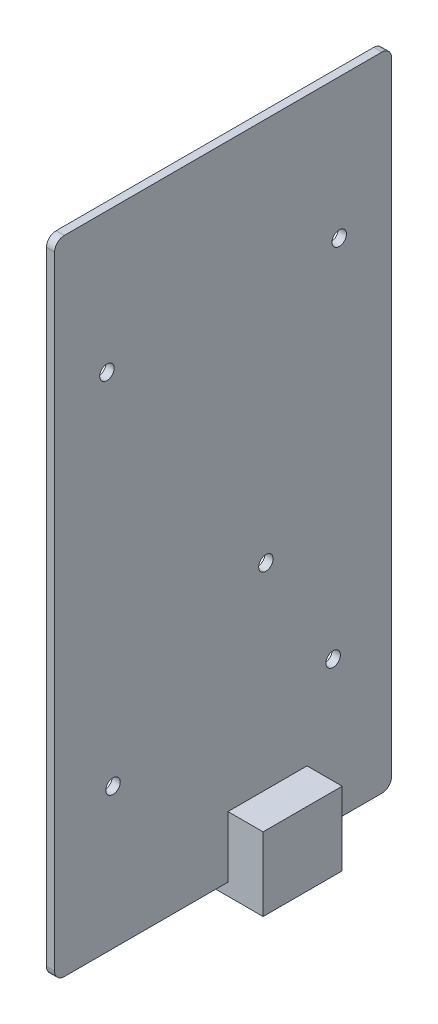
ISO-10303-21;
HEADER;
FILE_DESCRIPTION(('STEP AP214'),'2;1');
FILE_NAME('part.step','',(''),(''),'','','');
FILE_SCHEMA(('AUTOMOTIVE_DESIGN { 1 0 10303 214 1 1 1 1 }'));
ENDSEC;
DATA;
#1=APPLICATION_CONTEXT('core data for automotive mechanical design processes');
#2=APPLICATION_PROTOCOL_DEFINITION('international standard','automotive_design',2000,#1);
#3=PRODUCT_CONTEXT('',#1,'mechanical');
#4=PRODUCT('Part','Part','',(#3));
#5=PRODUCT_RELATED_PRODUCT_CATEGORY('part','',(#4));
#6=PRODUCT_DEFINITION_FORMATION('','',#4);
#7=PRODUCT_DEFINITION_CONTEXT('part definition',#1,'design');
#8=PRODUCT_DEFINITION('design','',#6,#7);
#9=PRODUCT_DEFINITION_SHAPE('','',#8);
#10=(LENGTH_UNIT() NAMED_UNIT(*) SI_UNIT(.MILLI.,.METRE.));
#11=(NAMED_UNIT(*) PLANE_ANGLE_UNIT() SI_UNIT($,.RADIAN.));
#12=(NAMED_UNIT(*) SI_UNIT($,.STERADIAN.) SOLID_ANGLE_UNIT());
#13=UNCERTAINTY_MEASURE_WITH_UNIT(LENGTH_MEASURE(1.E-05),#10,'distance_accuracy_value','');
#14=(GEOMETRIC_REPRESENTATION_CONTEXT(3) GLOBAL_UNCERTAINTY_ASSIGNED_CONTEXT((#13)) GLOBAL_UNIT_ASSIGNED_CONTEXT((#10,
#11,#12)) REPRESENTATION_CONTEXT('',''));
#15=CARTESIAN_POINT('',(0.,0.,0.));
#16=DIRECTION('',(0.,0.,1.));
#17=DIRECTION('',(1.,0.,0.));
#18=AXIS2_PLACEMENT_3D('',#15,#16,#17);
#19=CARTESIAN_POINT('',(1.7,-66.67,33.));
#20=DIRECTION('',(0.,1.,0.));
#21=DIRECTION('',(0.,0.,1.));
#22=AXIS2_PLACEMENT_3D('',#19,#20,#21);
#23=PLANE('',#22);
#24=DIRECTION('',(1.,0.,0.));
#25=VECTOR('',#24,1.);
#26=CARTESIAN_POINT('',(1.7,-66.67,-17.44));
#27=LINE('',#26,#25);
#28=CARTESIAN_POINT('',(0.,-66.67,-17.44));
#29=VERTEX_POINT('',#28);
#30=CARTESIAN_POINT('',(1.7,-66.67,-17.44));
#31=VERTEX_POINT('',#30);
#32=EDGE_CURVE('E456',#29,#31,#27,.T.);
#33=ORIENTED_EDGE('',*,*,#32,.F.);
#34=DIRECTION('',(0.,0.,-1.));
#35=VECTOR('',#34,1.);
#36=CARTESIAN_POINT('',(0.,-66.67,33.));
#37=LINE('',#36,#35);
#38=CARTESIAN_POINT('',(0.,-66.67,-33.));
#39=VERTEX_POINT('',#38);
#40=EDGE_CURVE('E429',#29,#39,#37,.T.);
#41=ORIENTED_EDGE('',*,*,#40,.T.);
#42=DIRECTION('',(-1.,0.,0.));
#43=VECTOR('',#42,1.);
#44=CARTESIAN_POINT('',(1.7,-66.67,-33.));
#45=LINE('',#44,#43);
#46=CARTESIAN_POINT('',(1.7,-66.67,-33.));
#47=VERTEX_POINT('',#46);
#48=EDGE_CURVE('E442',#47,#39,#45,.T.);
#49=ORIENTED_EDGE('',*,*,#48,.F.);
#50=DIRECTION('',(0.,0.,-1.));
#51=VECTOR('',#50,1.);
#52=CARTESIAN_POINT('',(1.7,-66.67,33.));
#53=LINE('',#52,#51);
#54=EDGE_CURVE('E404',#31,#47,#53,.T.);
#55=ORIENTED_EDGE('',*,*,#54,.F.);
#56=EDGE_LOOP('',(#33,#41,#49,#55));
#57=FACE_BOUND('',#56,.T.);
#58=ADVANCED_FACE('F176',(#57),#23,.F.);
#59=CARTESIAN_POINT('',(1.7,64.67,-33.));
#60=DIRECTION('',(1.,0.,0.));
#61=DIRECTION('',(0.,0.,-1.));
#62=AXIS2_PLACEMENT_3D('',#59,#60,#61);
#63=PLANE('',#62);
#64=DIRECTION('',(0.,-1.,0.));
#65=VECTOR('',#64,1.);
#66=CARTESIAN_POINT('',(1.7,64.67,-1.00999999999998));
#67=LINE('',#66,#65);
#68=CARTESIAN_POINT('',(1.7,-53.97,-1.01));
#69=VERTEX_POINT('',#68);
#70=CARTESIAN_POINT('',(1.7,-66.67,-1.01));
#71=VERTEX_POINT('',#70);
#72=EDGE_CURVE('E195',#69,#71,#67,.T.);
#73=ORIENTED_EDGE('',*,*,#72,.F.);
#74=DIRECTION('',(0.,0.,-1.));
#75=VECTOR('',#74,1.);
#76=CARTESIAN_POINT('',(1.7,-53.97,-33.));
#77=LINE('',#76,#75);
#78=CARTESIAN_POINT('',(1.7,-53.97,-17.44));
#79=VERTEX_POINT('',#78);
#80=EDGE_CURVE('E199',#69,#79,#77,.T.);
#81=ORIENTED_EDGE('',*,*,#80,.T.);
#82=DIRECTION('',(0.,-1.,0.));
#83=VECTOR('',#82,1.);
#84=CARTESIAN_POINT('',(1.7,64.67,-17.44));
#85=LINE('',#84,#83);
#86=EDGE_CURVE('E350',#79,#31,#85,.T.);
#87=ORIENTED_EDGE('',*,*,#86,.T.);
#88=ORIENTED_EDGE('',*,*,#54,.T.);
#89=CARTESIAN_POINT('',(1.7,-64.67,-33.));
#90=DIRECTION('',(-1.,0.,0.));
#91=DIRECTION('',(0.,0.,1.));
#92=AXIS2_PLACEMENT_3D('',#89,#90,#91);
#93=CIRCLE('',#92,2.);
#94=CARTESIAN_POINT('',(1.7,-64.67,-35.));
#95=VERTEX_POINT('',#94);
#96=EDGE_CURVE('E408',#95,#47,#93,.T.);
#97=ORIENTED_EDGE('',*,*,#96,.F.);
#98=DIRECTION('',(0.,-1.,0.));
#99=VECTOR('',#98,1.);
#100=CARTESIAN_POINT('',(1.7,64.67,-35.));
#101=LINE('',#100,#99);
#102=CARTESIAN_POINT('',(1.7,64.67,-35.));
#103=VERTEX_POINT('',#102);
#104=EDGE_CURVE('E411',#103,#95,#101,.T.);
#105=ORIENTED_EDGE('',*,*,#104,.F.);
#106=CARTESIAN_POINT('',(1.7,64.67,-33.));
#107=DIRECTION('',(1.,0.,0.));
#108=DIRECTION('',(0.,0.,-1.));
#109=AXIS2_PLACEMENT_3D('',#106,#107,#108);
#110=CIRCLE('',#109,2.);
#111=CARTESIAN_POINT('',(1.7,66.67,-33.));
#112=VERTEX_POINT('',#111);
#113=EDGE_CURVE('E390',#103,#112,#110,.T.);
#114=ORIENTED_EDGE('',*,*,#113,.T.);
#115=DIRECTION('',(0.,0.,-1.));
#116=VECTOR('',#115,1.);
#117=CARTESIAN_POINT('',(1.7,66.67,33.));
#118=LINE('',#117,#116);
#119=CARTESIAN_POINT('',(1.7,66.67,33.));
#120=VERTEX_POINT('',#119);
#121=EDGE_CURVE('E392',#120,#112,#118,.T.);
#122=ORIENTED_EDGE('',*,*,#121,.F.);
#123=CARTESIAN_POINT('',(1.7,64.67,33.));
#124=DIRECTION('',(1.,0.,0.));
#125=DIRECTION('',(0.,0.,-1.));
#126=AXIS2_PLACEMENT_3D('',#123,#124,#125);
#127=CIRCLE('',#126,2.);
#128=CARTESIAN_POINT('',(1.7,64.67,35.));
#129=VERTEX_POINT('',#128);
#130=EDGE_CURVE('E397',#120,#129,#127,.T.);
#131=ORIENTED_EDGE('',*,*,#130,.T.);
#132=DIRECTION('',(0.,-1.,0.));
#133=VECTOR('',#132,1.);
#134=CARTESIAN_POINT('',(1.7,64.67,35.));
#135=LINE('',#134,#133);
#136=CARTESIAN_POINT('',(1.7,-64.67,35.));
#137=VERTEX_POINT('',#136);
#138=EDGE_CURVE('E399',#129,#137,#135,.T.);
#139=ORIENTED_EDGE('',*,*,#138,.T.);
#140=CARTESIAN_POINT('',(1.7,-64.67,33.));
#141=DIRECTION('',(-1.,0.,0.));
#142=DIRECTION('',(0.,0.,1.));
#143=AXIS2_PLACEMENT_3D('',#140,#141,#142);
#144=CIRCLE('',#143,2.);
#145=CARTESIAN_POINT('',(1.7,-66.67,33.));
#146=VERTEX_POINT('',#145);
#147=EDGE_CURVE('E401',#146,#137,#144,.T.);
#148=ORIENTED_EDGE('',*,*,#147,.F.);
#149=EDGE_CURVE('E405',#146,#71,#53,.T.);
#150=ORIENTED_EDGE('',*,*,#149,.T.);
#151=EDGE_LOOP('',(#73,#81,#87,#88,#97,#105,#114,#122,#131,#139,#148,#150));
#152=FACE_BOUND('',#151,.T.);
#153=CARTESIAN_POINT('',(1.7,37.63,-24.13));
#154=DIRECTION('',(1.,0.,0.));
#155=DIRECTION('',(0.,0.,-1.));
#156=AXIS2_PLACEMENT_3D('',#153,#154,#155);
#157=CIRCLE('',#156,1.5);
#158=CARTESIAN_POINT('',(1.7,37.63,-25.63));
#159=VERTEX_POINT('',#158);
#160=EDGE_CURVE('E360',#159,#159,#157,.F.);
#161=ORIENTED_EDGE('',*,*,#160,.T.);
#162=EDGE_LOOP('',(#161));
#163=FACE_BOUND('',#162,.T.);
#164=CARTESIAN_POINT('',(1.7,-37.46,-22.86));
#165=DIRECTION('',(1.,0.,0.));
#166=DIRECTION('',(0.,0.,-1.));
#167=AXIS2_PLACEMENT_3D('',#164,#165,#166);
#168=CIRCLE('',#167,1.5);
#169=CARTESIAN_POINT('',(1.7,-37.46,-24.36));
#170=VERTEX_POINT('',#169);
#171=EDGE_CURVE('E372',#170,#170,#168,.T.);
#172=ORIENTED_EDGE('',*,*,#171,.F.);
#173=EDGE_LOOP('',(#172));
#174=FACE_BOUND('',#173,.T.);
#175=CARTESIAN_POINT('',(1.7,-37.46,22.86));
#176=DIRECTION('',(1.,0.,0.));
#177=DIRECTION('',(0.,0.,-1.));
#178=AXIS2_PLACEMENT_3D('',#175,#176,#177);
#179=CIRCLE('',#178,1.5);
#180=CARTESIAN_POINT('',(1.7,-37.46,21.36));
#181=VERTEX_POINT('',#180);
#182=EDGE_CURVE('E384',#181,#181,#179,.T.);
#183=ORIENTED_EDGE('',*,*,#182,.F.);
#184=EDGE_LOOP('',(#183));
#185=FACE_BOUND('',#184,.T.);
#186=CARTESIAN_POINT('',(1.7,-13.17,-8.89000000000001));
#187=DIRECTION('',(1.,0.,0.));
#188=DIRECTION('',(0.,0.,-1.));
#189=AXIS2_PLACEMENT_3D('',#186,#187,#188);
#190=CIRCLE('',#189,1.5);
#191=CARTESIAN_POINT('',(1.7,-13.17,-10.39));
#192=VERTEX_POINT('',#191);
#193=EDGE_CURVE('E378',#192,#192,#190,.T.);
#194=ORIENTED_EDGE('',*,*,#193,.F.);
#195=EDGE_LOOP('',(#194));
#196=FACE_BOUND('',#195,.T.);
#197=CARTESIAN_POINT('',(1.7,37.63,24.13));
#198=DIRECTION('',(1.,0.,0.));
#199=DIRECTION('',(0.,0.,-1.));
#200=AXIS2_PLACEMENT_3D('',#197,#198,#199);
#201=CIRCLE('',#200,1.5);
#202=CARTESIAN_POINT('',(1.7,37.63,22.63));
#203=VERTEX_POINT('',#202);
#204=EDGE_CURVE('E366',#203,#203,#201,.T.);
#205=ORIENTED_EDGE('',*,*,#204,.F.);
#206=EDGE_LOOP('',(#205));
#207=FACE_BOUND('',#206,.T.);
#208=ADVANCED_FACE('F466',(#152,#163,#174,#185,#196,#207),#63,.T.);
#209=CARTESIAN_POINT('',(0.,64.67,-33.));
#210=DIRECTION('',(1.,0.,0.));
#211=DIRECTION('',(0.,0.,-1.));
#212=AXIS2_PLACEMENT_3D('',#209,#210,#211);
#213=PLANE('',#212);
#214=CARTESIAN_POINT('',(0.,37.63,-24.13));
#215=DIRECTION('',(1.,0.,0.));
#216=DIRECTION('',(0.,0.,-1.));
#217=AXIS2_PLACEMENT_3D('',#214,#215,#216);
#218=CIRCLE('',#217,1.5);
#219=CARTESIAN_POINT('',(0.,37.63,-25.63));
#220=VERTEX_POINT('',#219);
#221=EDGE_CURVE('E359',#220,#220,#218,.F.);
#222=ORIENTED_EDGE('',*,*,#221,.F.);
#223=EDGE_LOOP('',(#222));
#224=FACE_BOUND('',#223,.T.);
#225=DIRECTION('',(0.,0.,-1.));
#226=VECTOR('',#225,1.);
#227=CARTESIAN_POINT('',(0.,-53.97,-33.));
#228=LINE('',#227,#226);
#229=CARTESIAN_POINT('',(0.,-53.97,-1.01));
#230=VERTEX_POINT('',#229);
#231=CARTESIAN_POINT('',(0.,-53.97,-17.44));
#232=VERTEX_POINT('',#231);
#233=EDGE_CURVE('E12',#230,#232,#228,.T.);
#234=ORIENTED_EDGE('',*,*,#233,.F.);
#235=DIRECTION('',(0.,-1.,0.));
#236=VECTOR('',#235,1.);
#237=CARTESIAN_POINT('',(0.,64.67,-1.00999999999998));
#238=LINE('',#237,#236);
#239=CARTESIAN_POINT('',(0.,-66.67,-1.01));
#240=VERTEX_POINT('',#239);
#241=EDGE_CURVE('E352',#230,#240,#238,.T.);
#242=ORIENTED_EDGE('',*,*,#241,.T.);
#243=CARTESIAN_POINT('',(0.,-66.67,33.));
#244=VERTEX_POINT('',#243);
#245=EDGE_CURVE('E430',#244,#240,#37,.T.);
#246=ORIENTED_EDGE('',*,*,#245,.F.);
#247=CARTESIAN_POINT('',(0.,-64.67,33.));
#248=DIRECTION('',(-1.,0.,0.));
#249=DIRECTION('',(0.,0.,1.));
#250=AXIS2_PLACEMENT_3D('',#247,#248,#249);
#251=CIRCLE('',#250,2.);
#252=CARTESIAN_POINT('',(0.,-64.67,35.));
#253=VERTEX_POINT('',#252);
#254=EDGE_CURVE('E426',#244,#253,#251,.T.);
#255=ORIENTED_EDGE('',*,*,#254,.T.);
#256=DIRECTION('',(0.,-1.,0.));
#257=VECTOR('',#256,1.);
#258=CARTESIAN_POINT('',(0.,64.67,35.));
#259=LINE('',#258,#257);
#260=CARTESIAN_POINT('',(0.,64.67,35.));
#261=VERTEX_POINT('',#260);
#262=EDGE_CURVE('E423',#261,#253,#259,.T.);
#263=ORIENTED_EDGE('',*,*,#262,.F.);
#264=CARTESIAN_POINT('',(0.,64.67,33.));
#265=DIRECTION('',(1.,0.,0.));
#266=DIRECTION('',(0.,0.,-1.));
#267=AXIS2_PLACEMENT_3D('',#264,#265,#266);
#268=CIRCLE('',#267,2.);
#269=CARTESIAN_POINT('',(0.,66.67,33.));
#270=VERTEX_POINT('',#269);
#271=EDGE_CURVE('E421',#270,#261,#268,.T.);
#272=ORIENTED_EDGE('',*,*,#271,.F.);
#273=DIRECTION('',(0.,0.,-1.));
#274=VECTOR('',#273,1.);
#275=CARTESIAN_POINT('',(0.,66.67,33.));
#276=LINE('',#275,#274);
#277=CARTESIAN_POINT('',(0.,66.67,-33.));
#278=VERTEX_POINT('',#277);
#279=EDGE_CURVE('E417',#270,#278,#276,.T.);
#280=ORIENTED_EDGE('',*,*,#279,.T.);
#281=CARTESIAN_POINT('',(0.,64.67,-33.));
#282=DIRECTION('',(1.,0.,0.));
#283=DIRECTION('',(0.,0.,-1.));
#284=AXIS2_PLACEMENT_3D('',#281,#282,#283);
#285=CIRCLE('',#284,2.);
#286=CARTESIAN_POINT('',(0.,64.67,-35.));
#287=VERTEX_POINT('',#286);
#288=EDGE_CURVE('E387',#287,#278,#285,.T.);
#289=ORIENTED_EDGE('',*,*,#288,.F.);
#290=DIRECTION('',(0.,-1.,0.));
#291=VECTOR('',#290,1.);
#292=CARTESIAN_POINT('',(0.,64.67,-35.));
#293=LINE('',#292,#291);
#294=CARTESIAN_POINT('',(0.,-64.67,-35.));
#295=VERTEX_POINT('',#294);
#296=EDGE_CURVE('E393',#287,#295,#293,.T.);
#297=ORIENTED_EDGE('',*,*,#296,.T.);
#298=CARTESIAN_POINT('',(0.,-64.67,-33.));
#299=DIRECTION('',(-1.,0.,0.));
#300=DIRECTION('',(0.,0.,1.));
#301=AXIS2_PLACEMENT_3D('',#298,#299,#300);
#302=CIRCLE('',#301,2.);
#303=EDGE_CURVE('E434',#295,#39,#302,.T.);
#304=ORIENTED_EDGE('',*,*,#303,.T.);
#305=ORIENTED_EDGE('',*,*,#40,.F.);
#306=DIRECTION('',(0.,-1.,0.));
#307=VECTOR('',#306,1.);
#308=CARTESIAN_POINT('',(0.,64.67,-17.44));
#309=LINE('',#308,#307);
#310=EDGE_CURVE('E341',#232,#29,#309,.T.);
#311=ORIENTED_EDGE('',*,*,#310,.F.);
#312=EDGE_LOOP('',(#234,#242,#246,#255,#263,#272,#280,#289,#297,#304,#305,#311));
#313=FACE_BOUND('',#312,.T.);
#314=CARTESIAN_POINT('',(0.,-37.46,22.86));
#315=DIRECTION('',(1.,0.,0.));
#316=DIRECTION('',(0.,0.,-1.));
#317=AXIS2_PLACEMENT_3D('',#314,#315,#316);
#318=CIRCLE('',#317,1.5);
#319=CARTESIAN_POINT('',(0.,-37.46,21.36));
#320=VERTEX_POINT('',#319);
#321=EDGE_CURVE('E381',#320,#320,#318,.T.);
#322=ORIENTED_EDGE('',*,*,#321,.T.);
#323=EDGE_LOOP('',(#322));
#324=FACE_BOUND('',#323,.T.);
#325=CARTESIAN_POINT('',(0.,-13.17,-8.89000000000001));
#326=DIRECTION('',(1.,0.,0.));
#327=DIRECTION('',(0.,0.,-1.));
#328=AXIS2_PLACEMENT_3D('',#325,#326,#327);
#329=CIRCLE('',#328,1.5);
#330=CARTESIAN_POINT('',(0.,-13.17,-10.39));
#331=VERTEX_POINT('',#330);
#332=EDGE_CURVE('E375',#331,#331,#329,.T.);
#333=ORIENTED_EDGE('',*,*,#332,.T.);
#334=EDGE_LOOP('',(#333));
#335=FACE_BOUND('',#334,.T.);
#336=CARTESIAN_POINT('',(0.,-37.46,-22.86));
#337=DIRECTION('',(1.,0.,0.));
#338=DIRECTION('',(0.,0.,-1.));
#339=AXIS2_PLACEMENT_3D('',#336,#337,#338);
#340=CIRCLE('',#339,1.5);
#341=CARTESIAN_POINT('',(0.,-37.46,-24.36));
#342=VERTEX_POINT('',#341);
#343=EDGE_CURVE('E369',#342,#342,#340,.T.);
#344=ORIENTED_EDGE('',*,*,#343,.T.);
#345=EDGE_LOOP('',(#344));
#346=FACE_BOUND('',#345,.T.);
#347=CARTESIAN_POINT('',(0.,37.63,24.13));
#348=DIRECTION('',(1.,0.,0.));
#349=DIRECTION('',(0.,0.,-1.));
#350=AXIS2_PLACEMENT_3D('',#347,#348,#349);
#351=CIRCLE('',#350,1.5);
#352=CARTESIAN_POINT('',(0.,37.63,22.63));
#353=VERTEX_POINT('',#352);
#354=EDGE_CURVE('E363',#353,#353,#351,.T.);
#355=ORIENTED_EDGE('',*,*,#354,.T.);
#356=EDGE_LOOP('',(#355));
#357=FACE_BOUND('',#356,.T.);
#358=ADVANCED_FACE('F507',(#224,#313,#324,#335,#346,#357),#213,.F.);
#359=CARTESIAN_POINT('',(1.7,64.67,-33.));
#360=DIRECTION('',(-1.,0.,0.));
#361=DIRECTION('',(0.,0.,1.));
#362=AXIS2_PLACEMENT_3D('',#359,#360,#361);
#363=CYLINDRICAL_SURFACE('',#362,2.);
#364=ORIENTED_EDGE('',*,*,#288,.T.);
#365=DIRECTION('',(-1.,0.,0.));
#366=VECTOR('',#365,1.);
#367=CARTESIAN_POINT('',(1.7,66.67,-33.));
#368=LINE('',#367,#366);
#369=EDGE_CURVE('E454',#112,#278,#368,.T.);
#370=ORIENTED_EDGE('',*,*,#369,.F.);
#371=ORIENTED_EDGE('',*,*,#113,.F.);
#372=DIRECTION('',(-1.,0.,0.));
#373=VECTOR('',#372,1.);
#374=CARTESIAN_POINT('',(1.7,64.67,-35.));
#375=LINE('',#374,#373);
#376=EDGE_CURVE('E414',#103,#287,#375,.T.);
#377=ORIENTED_EDGE('',*,*,#376,.T.);
#378=EDGE_LOOP('',(#364,#370,#371,#377));
#379=FACE_BOUND('',#378,.T.);
#380=ADVANCED_FACE('F178',(#379),#363,.T.);
#381=CARTESIAN_POINT('',(1.7,66.67,33.));
#382=DIRECTION('',(0.,1.,0.));
#383=DIRECTION('',(0.,0.,1.));
#384=AXIS2_PLACEMENT_3D('',#381,#382,#383);
#385=PLANE('',#384);
#386=ORIENTED_EDGE('',*,*,#279,.F.);
#387=DIRECTION('',(-1.,0.,0.));
#388=VECTOR('',#387,1.);
#389=CARTESIAN_POINT('',(1.7,66.67,33.));
#390=LINE('',#389,#388);
#391=EDGE_CURVE('E452',#120,#270,#390,.T.);
#392=ORIENTED_EDGE('',*,*,#391,.F.);
#393=ORIENTED_EDGE('',*,*,#121,.T.);
#394=ORIENTED_EDGE('',*,*,#369,.T.);
#395=EDGE_LOOP('',(#386,#392,#393,#394));
#396=FACE_BOUND('',#395,.T.);
#397=ADVANCED_FACE('F492',(#396),#385,.T.);
#398=CARTESIAN_POINT('',(1.7,64.67,33.));
#399=DIRECTION('',(-1.,0.,0.));
#400=DIRECTION('',(0.,0.,1.));
#401=AXIS2_PLACEMENT_3D('',#398,#399,#400);
#402=CYLINDRICAL_SURFACE('',#401,2.);
#403=ORIENTED_EDGE('',*,*,#271,.T.);
#404=DIRECTION('',(-1.,0.,0.));
#405=VECTOR('',#404,1.);
#406=CARTESIAN_POINT('',(1.7,64.67,35.));
#407=LINE('',#406,#405);
#408=EDGE_CURVE('E449',#129,#261,#407,.T.);
#409=ORIENTED_EDGE('',*,*,#408,.F.);
#410=ORIENTED_EDGE('',*,*,#130,.F.);
#411=ORIENTED_EDGE('',*,*,#391,.T.);
#412=EDGE_LOOP('',(#403,#409,#410,#411));
#413=FACE_BOUND('',#412,.T.);
#414=ADVANCED_FACE('F497',(#413),#402,.T.);
#415=CARTESIAN_POINT('',(1.7,64.67,35.));
#416=DIRECTION('',(0.,0.,-1.));
#417=DIRECTION('',(0.,1.,0.));
#418=AXIS2_PLACEMENT_3D('',#415,#416,#417);
#419=PLANE('',#418);
#420=ORIENTED_EDGE('',*,*,#262,.T.);
#421=DIRECTION('',(-1.,0.,0.));
#422=VECTOR('',#421,1.);
#423=CARTESIAN_POINT('',(1.7,-64.67,35.));
#424=LINE('',#423,#422);
#425=EDGE_CURVE('E447',#137,#253,#424,.T.);
#426=ORIENTED_EDGE('',*,*,#425,.F.);
#427=ORIENTED_EDGE('',*,*,#138,.F.);
#428=ORIENTED_EDGE('',*,*,#408,.T.);
#429=EDGE_LOOP('',(#420,#426,#427,#428));
#430=FACE_BOUND('',#429,.T.);
#431=ADVANCED_FACE('F501',(#430),#419,.F.);
#432=CARTESIAN_POINT('',(1.7,-64.67,33.));
#433=DIRECTION('',(-1.,0.,0.));
#434=DIRECTION('',(0.,0.,1.));
#435=AXIS2_PLACEMENT_3D('',#432,#433,#434);
#436=CYLINDRICAL_SURFACE('',#435,2.);
#437=ORIENTED_EDGE('',*,*,#254,.F.);
#438=DIRECTION('',(-1.,0.,0.));
#439=VECTOR('',#438,1.);
#440=CARTESIAN_POINT('',(1.7,-66.67,33.));
#441=LINE('',#440,#439);
#442=EDGE_CURVE('E445',#146,#244,#441,.T.);
#443=ORIENTED_EDGE('',*,*,#442,.F.);
#444=ORIENTED_EDGE('',*,*,#147,.T.);
#445=ORIENTED_EDGE('',*,*,#425,.T.);
#446=EDGE_LOOP('',(#437,#443,#444,#445));
#447=FACE_BOUND('',#446,.T.);
#448=ADVANCED_FACE('F505',(#447),#436,.T.);
#449=ORIENTED_EDGE('',*,*,#245,.T.);
#450=DIRECTION('',(1.,0.,0.));
#451=VECTOR('',#450,1.);
#452=CARTESIAN_POINT('',(1.7,-66.67,-1.01));
#453=LINE('',#452,#451);
#454=EDGE_CURVE('E185',#240,#71,#453,.T.);
#455=ORIENTED_EDGE('',*,*,#454,.T.);
#456=ORIENTED_EDGE('',*,*,#149,.F.);
#457=ORIENTED_EDGE('',*,*,#442,.T.);
#458=EDGE_LOOP('',(#449,#455,#456,#457));
#459=FACE_BOUND('',#458,.T.);
#460=ADVANCED_FACE('F462',(#459),#23,.F.);
#461=CARTESIAN_POINT('',(1.7,-64.67,-33.));
#462=DIRECTION('',(-1.,0.,0.));
#463=DIRECTION('',(0.,0.,1.));
#464=AXIS2_PLACEMENT_3D('',#461,#462,#463);
#465=CYLINDRICAL_SURFACE('',#464,2.);
#466=ORIENTED_EDGE('',*,*,#303,.F.);
#467=DIRECTION('',(-1.,0.,0.));
#468=VECTOR('',#467,1.);
#469=CARTESIAN_POINT('',(1.7,-64.67,-35.));
#470=LINE('',#469,#468);
#471=EDGE_CURVE('E440',#95,#295,#470,.T.);
#472=ORIENTED_EDGE('',*,*,#471,.F.);
#473=ORIENTED_EDGE('',*,*,#96,.T.);
#474=ORIENTED_EDGE('',*,*,#48,.T.);
#475=EDGE_LOOP('',(#466,#472,#473,#474));
#476=FACE_BOUND('',#475,.T.);
#477=ADVANCED_FACE('F481',(#476),#465,.T.);
#478=CARTESIAN_POINT('',(1.7,64.67,-35.));
#479=DIRECTION('',(0.,0.,-1.));
#480=DIRECTION('',(0.,1.,0.));
#481=AXIS2_PLACEMENT_3D('',#478,#479,#480);
#482=PLANE('',#481);
#483=ORIENTED_EDGE('',*,*,#296,.F.);
#484=ORIENTED_EDGE('',*,*,#376,.F.);
#485=ORIENTED_EDGE('',*,*,#104,.T.);
#486=ORIENTED_EDGE('',*,*,#471,.T.);
#487=EDGE_LOOP('',(#483,#484,#485,#486));
#488=FACE_BOUND('',#487,.T.);
#489=ADVANCED_FACE('F484',(#488),#482,.T.);
#490=CARTESIAN_POINT('',(1.7,-37.46,22.86));
#491=DIRECTION('',(-1.,0.,0.));
#492=DIRECTION('',(0.,0.,1.));
#493=AXIS2_PLACEMENT_3D('',#490,#491,#492);
#494=CYLINDRICAL_SURFACE('',#493,1.5);
#495=ORIENTED_EDGE('',*,*,#182,.T.);
#496=EDGE_LOOP('',(#495));
#497=FACE_BOUND('',#496,.T.);
#498=ORIENTED_EDGE('',*,*,#321,.F.);
#499=EDGE_LOOP('',(#498));
#500=FACE_BOUND('',#499,.T.);
#501=ADVANCED_FACE('F559',(#497,#500),#494,.F.);
#502=CARTESIAN_POINT('',(1.7,-13.17,-8.89000000000001));
#503=DIRECTION('',(-1.,0.,0.));
#504=DIRECTION('',(0.,0.,1.));
#505=AXIS2_PLACEMENT_3D('',#502,#503,#504);
#506=CYLINDRICAL_SURFACE('',#505,1.5);
#507=ORIENTED_EDGE('',*,*,#193,.T.);
#508=EDGE_LOOP('',(#507));
#509=FACE_BOUND('',#508,.T.);
#510=ORIENTED_EDGE('',*,*,#332,.F.);
#511=EDGE_LOOP('',(#510));
#512=FACE_BOUND('',#511,.T.);
#513=ADVANCED_FACE('F563',(#509,#512),#506,.F.);
#514=CARTESIAN_POINT('',(1.7,-37.46,-22.86));
#515=DIRECTION('',(-1.,0.,0.));
#516=DIRECTION('',(0.,0.,1.));
#517=AXIS2_PLACEMENT_3D('',#514,#515,#516);
#518=CYLINDRICAL_SURFACE('',#517,1.5);
#519=ORIENTED_EDGE('',*,*,#171,.T.);
#520=EDGE_LOOP('',(#519));
#521=FACE_BOUND('',#520,.T.);
#522=ORIENTED_EDGE('',*,*,#343,.F.);
#523=EDGE_LOOP('',(#522));
#524=FACE_BOUND('',#523,.T.);
#525=ADVANCED_FACE('F568',(#521,#524),#518,.F.);
#526=CARTESIAN_POINT('',(1.7,37.63,24.13));
#527=DIRECTION('',(-1.,0.,0.));
#528=DIRECTION('',(0.,0.,1.));
#529=AXIS2_PLACEMENT_3D('',#526,#527,#528);
#530=CYLINDRICAL_SURFACE('',#529,1.5);
#531=ORIENTED_EDGE('',*,*,#204,.T.);
#532=EDGE_LOOP('',(#531));
#533=FACE_BOUND('',#532,.T.);
#534=ORIENTED_EDGE('',*,*,#354,.F.);
#535=EDGE_LOOP('',(#534));
#536=FACE_BOUND('',#535,.T.);
#537=ADVANCED_FACE('F575',(#533,#536),#530,.F.);
#538=CARTESIAN_POINT('',(1.7,37.63,-24.13));
#539=DIRECTION('',(-1.,0.,0.));
#540=DIRECTION('',(0.,0.,1.));
#541=AXIS2_PLACEMENT_3D('',#538,#539,#540);
#542=CYLINDRICAL_SURFACE('',#541,1.5);
#543=ORIENTED_EDGE('',*,*,#160,.F.);
#544=EDGE_LOOP('',(#543));
#545=FACE_BOUND('',#544,.T.);
#546=ORIENTED_EDGE('',*,*,#221,.T.);
#547=EDGE_LOOP('',(#546));
#548=FACE_BOUND('',#547,.T.);
#549=ADVANCED_FACE('F579',(#545,#548),#542,.F.);
#550=CARTESIAN_POINT('',(-2.4,-53.97,-1.01));
#551=DIRECTION('',(0.,-1.,0.));
#552=DIRECTION('',(0.,0.,-1.));
#553=AXIS2_PLACEMENT_3D('',#550,#551,#552);
#554=PLANE('',#553);
#555=DIRECTION('',(1.,0.,0.));
#556=VECTOR('',#555,1.);
#557=CARTESIAN_POINT('',(-2.4,-53.97,-1.01));
#558=LINE('',#557,#556);
#559=CARTESIAN_POINT('',(-2.4,-53.97,-1.01));
#560=VERTEX_POINT('',#559);
#561=EDGE_CURVE('E337',#560,#230,#558,.T.);
#562=ORIENTED_EDGE('',*,*,#561,.T.);
#563=ORIENTED_EDGE('',*,*,#233,.T.);
#564=DIRECTION('',(1.,0.,0.));
#565=VECTOR('',#564,1.);
#566=CARTESIAN_POINT('',(-2.4,-53.97,-17.44));
#567=LINE('',#566,#565);
#568=CARTESIAN_POINT('',(-2.4,-53.97,-17.44));
#569=VERTEX_POINT('',#568);
#570=EDGE_CURVE('E343',#569,#232,#567,.T.);
#571=ORIENTED_EDGE('',*,*,#570,.F.);
#572=DIRECTION('',(0.,0.,-1.));
#573=VECTOR('',#572,1.);
#574=CARTESIAN_POINT('',(-2.4,-53.97,-1.01));
#575=LINE('',#574,#573);
#576=EDGE_CURVE('E310',#560,#569,#575,.T.);
#577=ORIENTED_EDGE('',*,*,#576,.F.);
#578=EDGE_LOOP('',(#562,#563,#571,#577));
#579=FACE_BOUND('',#578,.T.);
#580=ADVANCED_FACE('F511',(#579),#554,.F.);
#581=CARTESIAN_POINT('',(-2.4,-53.97,-1.01));
#582=DIRECTION('',(0.,0.,1.));
#583=DIRECTION('',(0.,-1.,0.));
#584=AXIS2_PLACEMENT_3D('',#581,#582,#583);
#585=PLANE('',#584);
#586=CARTESIAN_POINT('',(9.,-53.97,-1.01));
#587=VERTEX_POINT('',#586);
#588=EDGE_CURVE('E342',#69,#587,#558,.T.);
#589=ORIENTED_EDGE('',*,*,#588,.F.);
#590=ORIENTED_EDGE('',*,*,#72,.T.);
#591=ORIENTED_EDGE('',*,*,#454,.F.);
#592=ORIENTED_EDGE('',*,*,#241,.F.);
#593=ORIENTED_EDGE('',*,*,#561,.F.);
#594=DIRECTION('',(0.,-1.,0.));
#595=VECTOR('',#594,1.);
#596=CARTESIAN_POINT('',(-2.4,-53.97,-1.01));
#597=LINE('',#596,#595);
#598=CARTESIAN_POINT('',(-2.4,-69.21,-1.01));
#599=VERTEX_POINT('',#598);
#600=EDGE_CURVE('E304',#560,#599,#597,.T.);
#601=ORIENTED_EDGE('',*,*,#600,.T.);
#602=DIRECTION('',(1.,0.,0.));
#603=VECTOR('',#602,1.);
#604=CARTESIAN_POINT('',(-2.4,-69.21,-1.01));
#605=LINE('',#604,#603);
#606=CARTESIAN_POINT('',(9.,-69.21,-1.01));
#607=VERTEX_POINT('',#606);
#608=EDGE_CURVE('E296',#599,#607,#605,.T.);
#609=ORIENTED_EDGE('',*,*,#608,.T.);
#610=DIRECTION('',(0.,-1.,0.));
#611=VECTOR('',#610,1.);
#612=CARTESIAN_POINT('',(9.,-53.97,-1.01));
#613=LINE('',#612,#611);
#614=EDGE_CURVE('E301',#587,#607,#613,.T.);
#615=ORIENTED_EDGE('',*,*,#614,.F.);
#616=EDGE_LOOP('',(#589,#590,#591,#592,#593,#601,#609,#615));
#617=FACE_BOUND('',#616,.T.);
#618=ADVANCED_FACE('F299',(#617),#585,.T.);
#619=ORIENTED_EDGE('',*,*,#80,.F.);
#620=ORIENTED_EDGE('',*,*,#588,.T.);
#621=DIRECTION('',(0.,0.,-1.));
#622=VECTOR('',#621,1.);
#623=CARTESIAN_POINT('',(9.,-53.97,-1.01));
#624=LINE('',#623,#622);
#625=CARTESIAN_POINT('',(9.,-53.97,-17.44));
#626=VERTEX_POINT('',#625);
#627=EDGE_CURVE('E323',#587,#626,#624,.T.);
#628=ORIENTED_EDGE('',*,*,#627,.T.);
#629=EDGE_CURVE('E346',#79,#626,#567,.T.);
#630=ORIENTED_EDGE('',*,*,#629,.F.);
#631=EDGE_LOOP('',(#619,#620,#628,#630));
#632=FACE_BOUND('',#631,.T.);
#633=ADVANCED_FACE('F470',(#632),#554,.F.);
#634=CARTESIAN_POINT('',(-2.4,-53.97,-17.44));
#635=DIRECTION('',(0.,0.,1.));
#636=DIRECTION('',(0.,-1.,0.));
#637=AXIS2_PLACEMENT_3D('',#634,#635,#636);
#638=PLANE('',#637);
#639=ORIENTED_EDGE('',*,*,#86,.F.);
#640=ORIENTED_EDGE('',*,*,#629,.T.);
#641=DIRECTION('',(0.,-1.,0.));
#642=VECTOR('',#641,1.);
#643=CARTESIAN_POINT('',(9.,-53.97,-17.44));
#644=LINE('',#643,#642);
#645=CARTESIAN_POINT('',(9.,-69.21,-17.44));
#646=VERTEX_POINT('',#645);
#647=EDGE_CURVE('E319',#626,#646,#644,.T.);
#648=ORIENTED_EDGE('',*,*,#647,.T.);
#649=DIRECTION('',(1.,0.,0.));
#650=VECTOR('',#649,1.);
#651=CARTESIAN_POINT('',(-2.4,-69.21,-17.44));
#652=LINE('',#651,#650);
#653=CARTESIAN_POINT('',(-2.4,-69.21,-17.44));
#654=VERTEX_POINT('',#653);
#655=EDGE_CURVE('E309',#654,#646,#652,.T.);
#656=ORIENTED_EDGE('',*,*,#655,.F.);
#657=DIRECTION('',(0.,-1.,0.));
#658=VECTOR('',#657,1.);
#659=CARTESIAN_POINT('',(-2.4,-53.97,-17.44));
#660=LINE('',#659,#658);
#661=EDGE_CURVE('E333',#569,#654,#660,.T.);
#662=ORIENTED_EDGE('',*,*,#661,.F.);
#663=ORIENTED_EDGE('',*,*,#570,.T.);
#664=ORIENTED_EDGE('',*,*,#310,.T.);
#665=ORIENTED_EDGE('',*,*,#32,.T.);
#666=EDGE_LOOP('',(#639,#640,#648,#656,#662,#663,#664,#665));
#667=FACE_BOUND('',#666,.T.);
#668=ADVANCED_FACE('F473',(#667),#638,.F.);
#669=CARTESIAN_POINT('',(-2.4,-69.21,-1.01));
#670=DIRECTION('',(0.,-1.,0.));
#671=DIRECTION('',(0.,0.,-1.));
#672=AXIS2_PLACEMENT_3D('',#669,#670,#671);
#673=PLANE('',#672);
#674=ORIENTED_EDGE('',*,*,#655,.T.);
#675=DIRECTION('',(0.,0.,-1.));
#676=VECTOR('',#675,1.);
#677=CARTESIAN_POINT('',(9.,-69.21,-1.01));
#678=LINE('',#677,#676);
#679=EDGE_CURVE('E313',#607,#646,#678,.T.);
#680=ORIENTED_EDGE('',*,*,#679,.F.);
#681=ORIENTED_EDGE('',*,*,#608,.F.);
#682=DIRECTION('',(0.,0.,-1.));
#683=VECTOR('',#682,1.);
#684=CARTESIAN_POINT('',(-2.4,-69.21,-1.01));
#685=LINE('',#684,#683);
#686=EDGE_CURVE('E330',#599,#654,#685,.T.);
#687=ORIENTED_EDGE('',*,*,#686,.T.);
#688=EDGE_LOOP('',(#674,#680,#681,#687));
#689=FACE_BOUND('',#688,.T.);
#690=ADVANCED_FACE('F314',(#689),#673,.T.);
#691=CARTESIAN_POINT('',(-2.4,0.,0.));
#692=DIRECTION('',(1.,0.,0.));
#693=DIRECTION('',(0.,0.,-1.));
#694=AXIS2_PLACEMENT_3D('',#691,#692,#693);
#695=PLANE('',#694);
#696=ORIENTED_EDGE('',*,*,#600,.F.);
#697=ORIENTED_EDGE('',*,*,#576,.T.);
#698=ORIENTED_EDGE('',*,*,#661,.T.);
#699=ORIENTED_EDGE('',*,*,#686,.F.);
#700=EDGE_LOOP('',(#696,#697,#698,#699));
#701=FACE_BOUND('',#700,.T.);
#702=ADVANCED_FACE('F515',(#701),#695,.F.);
#703=CARTESIAN_POINT('',(9.,0.,0.));
#704=DIRECTION('',(1.,0.,0.));
#705=DIRECTION('',(0.,0.,-1.));
#706=AXIS2_PLACEMENT_3D('',#703,#704,#705);
#707=PLANE('',#706);
#708=ORIENTED_EDGE('',*,*,#614,.T.);
#709=ORIENTED_EDGE('',*,*,#679,.T.);
#710=ORIENTED_EDGE('',*,*,#647,.F.);
#711=ORIENTED_EDGE('',*,*,#627,.F.);
#712=EDGE_LOOP('',(#708,#709,#710,#711));
#713=FACE_BOUND('',#712,.T.);
#714=ADVANCED_FACE('F321',(#713),#707,.T.);
#715=CLOSED_SHELL('',(#58,#208,#358,#380,#397,#414,#431,#448,#460,#477,#489,#501,#513,#525,#537,
#549,#580,#618,#633,#668,#690,#702,#714));
#716=MANIFOLD_SOLID_BREP('B2',#715);
#717=ADVANCED_BREP_SHAPE_REPRESENTATION('',(#18,#716),#14);
#718=SHAPE_DEFINITION_REPRESENTATION(#9,#717);
ENDSEC;
END-ISO-10303-21;
